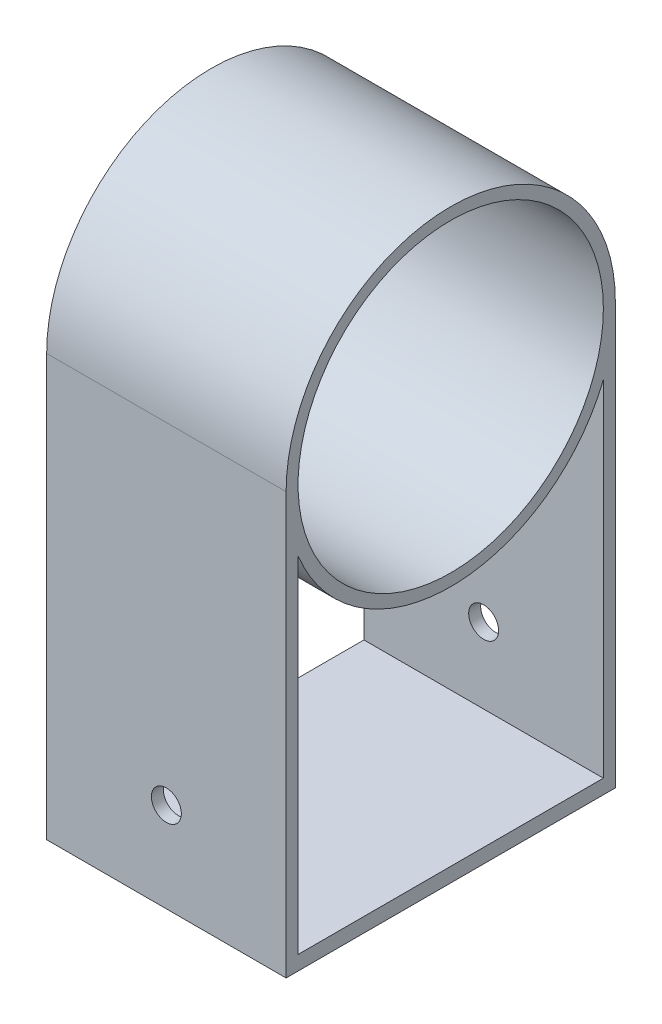
ISO-10303-21;
HEADER;
FILE_DESCRIPTION(('STEP AP214'),'2;1');
FILE_NAME('part.step','',(''),(''),'','','');
FILE_SCHEMA(('AUTOMOTIVE_DESIGN { 1 0 10303 214 1 1 1 1 }'));
ENDSEC;
DATA;
#1=APPLICATION_CONTEXT('core data for automotive mechanical design processes');
#2=APPLICATION_PROTOCOL_DEFINITION('international standard','automotive_design',2000,#1);
#3=PRODUCT_CONTEXT('',#1,'mechanical');
#4=PRODUCT('Part','Part','',(#3));
#5=PRODUCT_RELATED_PRODUCT_CATEGORY('part','',(#4));
#6=PRODUCT_DEFINITION_FORMATION('','',#4);
#7=PRODUCT_DEFINITION_CONTEXT('part definition',#1,'design');
#8=PRODUCT_DEFINITION('design','',#6,#7);
#9=PRODUCT_DEFINITION_SHAPE('','',#8);
#10=(LENGTH_UNIT() NAMED_UNIT(*) SI_UNIT(.MILLI.,.METRE.));
#11=(NAMED_UNIT(*) PLANE_ANGLE_UNIT() SI_UNIT($,.RADIAN.));
#12=(NAMED_UNIT(*) SI_UNIT($,.STERADIAN.) SOLID_ANGLE_UNIT());
#13=UNCERTAINTY_MEASURE_WITH_UNIT(LENGTH_MEASURE(1.E-05),#10,'distance_accuracy_value','');
#14=(GEOMETRIC_REPRESENTATION_CONTEXT(3) GLOBAL_UNCERTAINTY_ASSIGNED_CONTEXT((#13)) GLOBAL_UNIT_ASSIGNED_CONTEXT((#10,
#11,#12)) REPRESENTATION_CONTEXT('',''));
#15=CARTESIAN_POINT('',(0.,0.,0.));
#16=DIRECTION('',(0.,0.,1.));
#17=DIRECTION('',(1.,0.,0.));
#18=AXIS2_PLACEMENT_3D('',#15,#16,#17);
#19=CARTESIAN_POINT('',(-40.,0.,0.));
#20=DIRECTION('',(1.,0.,0.));
#21=DIRECTION('',(0.,0.,-1.));
#22=AXIS2_PLACEMENT_3D('',#19,#20,#21);
#23=CYLINDRICAL_SURFACE('',#22,27.5);
#24=CARTESIAN_POINT('',(0.,0.,0.));
#25=DIRECTION('',(1.,0.,0.));
#26=DIRECTION('',(0.,0.,-1.));
#27=AXIS2_PLACEMENT_3D('',#24,#25,#26);
#28=CIRCLE('',#27,27.5);
#29=CARTESIAN_POINT('',(0.,0.,-27.5));
#30=VERTEX_POINT('',#29);
#31=CARTESIAN_POINT('',(0.,0.,27.5));
#32=VERTEX_POINT('',#31);
#33=EDGE_CURVE('E161',#30,#32,#28,.T.);
#34=ORIENTED_EDGE('',*,*,#33,.F.);
#35=DIRECTION('',(1.,0.,0.));
#36=VECTOR('',#35,1.);
#37=CARTESIAN_POINT('',(-40.,0.,-27.5));
#38=LINE('',#37,#36);
#39=CARTESIAN_POINT('',(-40.,0.,-27.5));
#40=VERTEX_POINT('',#39);
#41=EDGE_CURVE('E11',#40,#30,#38,.T.);
#42=ORIENTED_EDGE('',*,*,#41,.F.);
#43=CARTESIAN_POINT('',(-40.,0.,0.));
#44=DIRECTION('',(1.,0.,0.));
#45=DIRECTION('',(0.,0.,-1.));
#46=AXIS2_PLACEMENT_3D('',#43,#44,#45);
#47=CIRCLE('',#46,27.5);
#48=CARTESIAN_POINT('',(-40.,0.,27.5));
#49=VERTEX_POINT('',#48);
#50=EDGE_CURVE('E165',#40,#49,#47,.T.);
#51=ORIENTED_EDGE('',*,*,#50,.T.);
#52=DIRECTION('',(1.,0.,0.));
#53=VECTOR('',#52,1.);
#54=CARTESIAN_POINT('',(-40.,0.,27.5));
#55=LINE('',#54,#53);
#56=EDGE_CURVE('E182',#49,#32,#55,.T.);
#57=ORIENTED_EDGE('',*,*,#56,.T.);
#58=EDGE_LOOP('',(#34,#42,#51,#57));
#59=FACE_BOUND('',#58,.T.);
#60=ADVANCED_FACE('F39',(#59),#23,.T.);
#61=CARTESIAN_POINT('',(-40.,-70.3541191911258,-27.5));
#62=DIRECTION('',(0.,0.,-1.));
#63=DIRECTION('',(-1.,0.,0.));
#64=AXIS2_PLACEMENT_3D('',#61,#62,#63);
#65=PLANE('',#64);
#66=CARTESIAN_POINT('',(-20.,-55.3541191911258,-27.5));
#67=DIRECTION('',(0.,0.,1.));
#68=DIRECTION('',(1.,0.,0.));
#69=AXIS2_PLACEMENT_3D('',#66,#67,#68);
#70=CIRCLE('',#69,2.5);
#71=CARTESIAN_POINT('',(-17.5,-55.3541191911258,-27.5));
#72=VERTEX_POINT('',#71);
#73=EDGE_CURVE('E340',#72,#72,#70,.T.);
#74=ORIENTED_EDGE('',*,*,#73,.T.);
#75=EDGE_LOOP('',(#74));
#76=FACE_BOUND('',#75,.T.);
#77=DIRECTION('',(0.,1.,0.));
#78=VECTOR('',#77,1.);
#79=CARTESIAN_POINT('',(0.,-70.3541191911258,-27.5));
#80=LINE('',#79,#78);
#81=CARTESIAN_POINT('',(0.,-70.3541191911258,-27.5));
#82=VERTEX_POINT('',#81);
#83=EDGE_CURVE('E170',#82,#30,#80,.T.);
#84=ORIENTED_EDGE('',*,*,#83,.F.);
#85=DIRECTION('',(1.,0.,0.));
#86=VECTOR('',#85,1.);
#87=CARTESIAN_POINT('',(-40.,-70.3541191911258,-27.5));
#88=LINE('',#87,#86);
#89=CARTESIAN_POINT('',(-40.,-70.3541191911258,-27.5));
#90=VERTEX_POINT('',#89);
#91=EDGE_CURVE('E48',#90,#82,#88,.T.);
#92=ORIENTED_EDGE('',*,*,#91,.F.);
#93=DIRECTION('',(0.,1.,0.));
#94=VECTOR('',#93,1.);
#95=CARTESIAN_POINT('',(-40.,-70.3541191911258,-27.5));
#96=LINE('',#95,#94);
#97=EDGE_CURVE('E178',#90,#40,#96,.T.);
#98=ORIENTED_EDGE('',*,*,#97,.T.);
#99=ORIENTED_EDGE('',*,*,#41,.T.);
#100=EDGE_LOOP('',(#84,#92,#98,#99));
#101=FACE_BOUND('',#100,.T.);
#102=ADVANCED_FACE('F214',(#76,#101),#65,.T.);
#103=CARTESIAN_POINT('',(-40.,-70.3541191911258,27.5));
#104=DIRECTION('',(0.,-1.,0.));
#105=DIRECTION('',(0.,0.,-1.));
#106=AXIS2_PLACEMENT_3D('',#103,#104,#105);
#107=PLANE('',#106);
#108=DIRECTION('',(0.,0.,-1.));
#109=VECTOR('',#108,1.);
#110=CARTESIAN_POINT('',(0.,-70.3541191911258,27.5));
#111=LINE('',#110,#109);
#112=CARTESIAN_POINT('',(0.,-70.3541191911258,27.5));
#113=VERTEX_POINT('',#112);
#114=EDGE_CURVE('E190',#113,#82,#111,.T.);
#115=ORIENTED_EDGE('',*,*,#114,.F.);
#116=DIRECTION('',(1.,0.,0.));
#117=VECTOR('',#116,1.);
#118=CARTESIAN_POINT('',(-40.,-70.3541191911258,27.5));
#119=LINE('',#118,#117);
#120=CARTESIAN_POINT('',(-40.,-70.3541191911258,27.5));
#121=VERTEX_POINT('',#120);
#122=EDGE_CURVE('E199',#121,#113,#119,.T.);
#123=ORIENTED_EDGE('',*,*,#122,.F.);
#124=DIRECTION('',(0.,0.,-1.));
#125=VECTOR('',#124,1.);
#126=CARTESIAN_POINT('',(-40.,-70.3541191911258,27.5));
#127=LINE('',#126,#125);
#128=EDGE_CURVE('E174',#121,#90,#127,.T.);
#129=ORIENTED_EDGE('',*,*,#128,.T.);
#130=ORIENTED_EDGE('',*,*,#91,.T.);
#131=EDGE_LOOP('',(#115,#123,#129,#130));
#132=FACE_BOUND('',#131,.T.);
#133=ADVANCED_FACE('F219',(#132),#107,.T.);
#134=CARTESIAN_POINT('',(-40.,0.,27.5));
#135=DIRECTION('',(0.,0.,1.));
#136=DIRECTION('',(1.,0.,0.));
#137=AXIS2_PLACEMENT_3D('',#134,#135,#136);
#138=PLANE('',#137);
#139=CARTESIAN_POINT('',(-20.,-55.3541191911258,27.5));
#140=DIRECTION('',(0.,0.,1.));
#141=DIRECTION('',(1.,0.,0.));
#142=AXIS2_PLACEMENT_3D('',#139,#140,#141);
#143=CIRCLE('',#142,2.5);
#144=CARTESIAN_POINT('',(-17.5,-55.3541191911258,27.5));
#145=VERTEX_POINT('',#144);
#146=EDGE_CURVE('E348',#145,#145,#143,.T.);
#147=ORIENTED_EDGE('',*,*,#146,.F.);
#148=EDGE_LOOP('',(#147));
#149=FACE_BOUND('',#148,.T.);
#150=DIRECTION('',(0.,-1.,0.));
#151=VECTOR('',#150,1.);
#152=CARTESIAN_POINT('',(0.,0.,27.5));
#153=LINE('',#152,#151);
#154=EDGE_CURVE('E186',#32,#113,#153,.T.);
#155=ORIENTED_EDGE('',*,*,#154,.F.);
#156=ORIENTED_EDGE('',*,*,#56,.F.);
#157=DIRECTION('',(0.,-1.,0.));
#158=VECTOR('',#157,1.);
#159=CARTESIAN_POINT('',(-40.,0.,27.5));
#160=LINE('',#159,#158);
#161=EDGE_CURVE('E169',#49,#121,#160,.T.);
#162=ORIENTED_EDGE('',*,*,#161,.T.);
#163=ORIENTED_EDGE('',*,*,#122,.T.);
#164=EDGE_LOOP('',(#155,#156,#162,#163));
#165=FACE_BOUND('',#164,.T.);
#166=ADVANCED_FACE('F208',(#149,#165),#138,.T.);
#167=CARTESIAN_POINT('',(-40.,0.,0.));
#168=DIRECTION('',(1.,0.,0.));
#169=DIRECTION('',(0.,0.,-1.));
#170=AXIS2_PLACEMENT_3D('',#167,#168,#169);
#171=PLANE('',#170);
#172=DIRECTION('',(0.,1.,0.));
#173=VECTOR('',#172,1.);
#174=CARTESIAN_POINT('',(-40.,-67.9456465055895,-25.5));
#175=LINE('',#174,#173);
#176=CARTESIAN_POINT('',(-40.,-67.9456465055895,-25.5));
#177=VERTEX_POINT('',#176);
#178=CARTESIAN_POINT('',(-40.,-10.295630140987,-25.5));
#179=VERTEX_POINT('',#178);
#180=EDGE_CURVE('E114',#177,#179,#175,.T.);
#181=ORIENTED_EDGE('',*,*,#180,.T.);
#182=CARTESIAN_POINT('',(-40.,0.,0.));
#183=DIRECTION('',(-1.,0.,0.));
#184=DIRECTION('',(0.,0.,-1.));
#185=AXIS2_PLACEMENT_3D('',#182,#183,#184);
#186=CIRCLE('',#185,27.5);
#187=CARTESIAN_POINT('',(-40.,-10.295630140987,25.5));
#188=VERTEX_POINT('',#187);
#189=EDGE_CURVE('E107',#179,#188,#186,.T.);
#190=ORIENTED_EDGE('',*,*,#189,.T.);
#191=DIRECTION('',(0.,-1.,0.));
#192=VECTOR('',#191,1.);
#193=CARTESIAN_POINT('',(-40.,-10.295630140987,25.5));
#194=LINE('',#193,#192);
#195=CARTESIAN_POINT('',(-40.,-67.9456465055895,25.5));
#196=VERTEX_POINT('',#195);
#197=EDGE_CURVE('E117',#188,#196,#194,.T.);
#198=ORIENTED_EDGE('',*,*,#197,.T.);
#199=DIRECTION('',(0.,0.,-1.));
#200=VECTOR('',#199,1.);
#201=CARTESIAN_POINT('',(-40.,-67.9456465055895,25.5));
#202=LINE('',#201,#200);
#203=EDGE_CURVE('E56',#196,#177,#202,.T.);
#204=ORIENTED_EDGE('',*,*,#203,.T.);
#205=EDGE_LOOP('',(#181,#190,#198,#204));
#206=FACE_BOUND('',#205,.T.);
#207=CARTESIAN_POINT('',(-40.,0.,0.));
#208=DIRECTION('',(1.,0.,0.));
#209=DIRECTION('',(0.,0.,-1.));
#210=AXIS2_PLACEMENT_3D('',#207,#208,#209);
#211=CIRCLE('',#210,25.5);
#212=CARTESIAN_POINT('',(-40.,0.,-25.5));
#213=VERTEX_POINT('',#212);
#214=EDGE_CURVE('E157',#213,#213,#211,.T.);
#215=ORIENTED_EDGE('',*,*,#214,.T.);
#216=EDGE_LOOP('',(#215));
#217=FACE_BOUND('',#216,.T.);
#218=ORIENTED_EDGE('',*,*,#50,.F.);
#219=ORIENTED_EDGE('',*,*,#97,.F.);
#220=ORIENTED_EDGE('',*,*,#128,.F.);
#221=ORIENTED_EDGE('',*,*,#161,.F.);
#222=EDGE_LOOP('',(#218,#219,#220,#221));
#223=FACE_BOUND('',#222,.T.);
#224=ADVANCED_FACE('F122',(#206,#217,#223),#171,.F.);
#225=CARTESIAN_POINT('',(0.,0.,0.));
#226=DIRECTION('',(1.,0.,0.));
#227=DIRECTION('',(0.,0.,-1.));
#228=AXIS2_PLACEMENT_3D('',#225,#226,#227);
#229=PLANE('',#228);
#230=CARTESIAN_POINT('',(0.,0.,0.));
#231=DIRECTION('',(-1.,0.,0.));
#232=DIRECTION('',(0.,0.,-1.));
#233=AXIS2_PLACEMENT_3D('',#230,#231,#232);
#234=CIRCLE('',#233,27.5);
#235=CARTESIAN_POINT('',(0.,-10.295630140987,-25.5));
#236=VERTEX_POINT('',#235);
#237=CARTESIAN_POINT('',(0.,-10.295630140987,25.5));
#238=VERTEX_POINT('',#237);
#239=EDGE_CURVE('E64',#236,#238,#234,.T.);
#240=ORIENTED_EDGE('',*,*,#239,.F.);
#241=DIRECTION('',(0.,1.,0.));
#242=VECTOR('',#241,1.);
#243=CARTESIAN_POINT('',(0.,-67.9456465055895,-25.5));
#244=LINE('',#243,#242);
#245=CARTESIAN_POINT('',(0.,-67.9456465055895,-25.5));
#246=VERTEX_POINT('',#245);
#247=EDGE_CURVE('E126',#246,#236,#244,.T.);
#248=ORIENTED_EDGE('',*,*,#247,.F.);
#249=DIRECTION('',(0.,0.,-1.));
#250=VECTOR('',#249,1.);
#251=CARTESIAN_POINT('',(0.,-67.9456465055895,25.5));
#252=LINE('',#251,#250);
#253=CARTESIAN_POINT('',(0.,-67.9456465055895,25.5));
#254=VERTEX_POINT('',#253);
#255=EDGE_CURVE('E130',#254,#246,#252,.T.);
#256=ORIENTED_EDGE('',*,*,#255,.F.);
#257=DIRECTION('',(0.,-1.,0.));
#258=VECTOR('',#257,1.);
#259=CARTESIAN_POINT('',(0.,-10.295630140987,25.5));
#260=LINE('',#259,#258);
#261=EDGE_CURVE('E142',#238,#254,#260,.T.);
#262=ORIENTED_EDGE('',*,*,#261,.F.);
#263=EDGE_LOOP('',(#240,#248,#256,#262));
#264=FACE_BOUND('',#263,.T.);
#265=CARTESIAN_POINT('',(0.,0.,0.));
#266=DIRECTION('',(1.,0.,0.));
#267=DIRECTION('',(0.,0.,-1.));
#268=AXIS2_PLACEMENT_3D('',#265,#266,#267);
#269=CIRCLE('',#268,25.5);
#270=CARTESIAN_POINT('',(0.,0.,-25.5));
#271=VERTEX_POINT('',#270);
#272=EDGE_CURVE('E151',#271,#271,#269,.T.);
#273=ORIENTED_EDGE('',*,*,#272,.F.);
#274=EDGE_LOOP('',(#273));
#275=FACE_BOUND('',#274,.T.);
#276=ORIENTED_EDGE('',*,*,#33,.T.);
#277=ORIENTED_EDGE('',*,*,#154,.T.);
#278=ORIENTED_EDGE('',*,*,#114,.T.);
#279=ORIENTED_EDGE('',*,*,#83,.T.);
#280=EDGE_LOOP('',(#276,#277,#278,#279));
#281=FACE_BOUND('',#280,.T.);
#282=ADVANCED_FACE('F211',(#264,#275,#281),#229,.T.);
#283=CARTESIAN_POINT('',(-40.,0.,0.));
#284=DIRECTION('',(1.,0.,0.));
#285=DIRECTION('',(0.,0.,-1.));
#286=AXIS2_PLACEMENT_3D('',#283,#284,#285);
#287=CYLINDRICAL_SURFACE('',#286,25.5);
#288=ORIENTED_EDGE('',*,*,#214,.F.);
#289=EDGE_LOOP('',(#288));
#290=FACE_BOUND('',#289,.T.);
#291=ORIENTED_EDGE('',*,*,#272,.T.);
#292=EDGE_LOOP('',(#291));
#293=FACE_BOUND('',#292,.T.);
#294=ADVANCED_FACE('F300',(#290,#293),#287,.F.);
#295=CARTESIAN_POINT('',(-40.,0.,0.));
#296=DIRECTION('',(1.,0.,0.));
#297=DIRECTION('',(0.,0.,-1.));
#298=AXIS2_PLACEMENT_3D('',#295,#296,#297);
#299=CYLINDRICAL_SURFACE('',#298,27.5);
#300=ORIENTED_EDGE('',*,*,#239,.T.);
#301=DIRECTION('',(1.,0.,0.));
#302=VECTOR('',#301,1.);
#303=CARTESIAN_POINT('',(-40.,-10.295630140987,25.5));
#304=LINE('',#303,#302);
#305=EDGE_CURVE('E103',#188,#238,#304,.T.);
#306=ORIENTED_EDGE('',*,*,#305,.F.);
#307=ORIENTED_EDGE('',*,*,#189,.F.);
#308=DIRECTION('',(1.,0.,0.));
#309=VECTOR('',#308,1.);
#310=CARTESIAN_POINT('',(-40.,-10.295630140987,-25.5));
#311=LINE('',#310,#309);
#312=EDGE_CURVE('E148',#179,#236,#311,.T.);
#313=ORIENTED_EDGE('',*,*,#312,.T.);
#314=EDGE_LOOP('',(#300,#306,#307,#313));
#315=FACE_BOUND('',#314,.T.);
#316=ADVANCED_FACE('F105',(#315),#299,.T.);
#317=CARTESIAN_POINT('',(-40.,-67.9456465055895,-25.5));
#318=DIRECTION('',(0.,0.,-1.));
#319=DIRECTION('',(-1.,0.,0.));
#320=AXIS2_PLACEMENT_3D('',#317,#318,#319);
#321=PLANE('',#320);
#322=CARTESIAN_POINT('',(-20.,-55.3541191911258,-25.5));
#323=DIRECTION('',(0.,0.,-1.));
#324=DIRECTION('',(-1.,0.,0.));
#325=AXIS2_PLACEMENT_3D('',#322,#323,#324);
#326=CIRCLE('',#325,2.5);
#327=CARTESIAN_POINT('',(-22.5,-55.3541191911258,-25.5));
#328=VERTEX_POINT('',#327);
#329=EDGE_CURVE('E133',#328,#328,#326,.T.);
#330=ORIENTED_EDGE('',*,*,#329,.T.);
#331=EDGE_LOOP('',(#330));
#332=FACE_BOUND('',#331,.T.);
#333=ORIENTED_EDGE('',*,*,#247,.T.);
#334=ORIENTED_EDGE('',*,*,#312,.F.);
#335=ORIENTED_EDGE('',*,*,#180,.F.);
#336=DIRECTION('',(1.,0.,0.));
#337=VECTOR('',#336,1.);
#338=CARTESIAN_POINT('',(-40.,-67.9456465055895,-25.5));
#339=LINE('',#338,#337);
#340=EDGE_CURVE('E152',#177,#246,#339,.T.);
#341=ORIENTED_EDGE('',*,*,#340,.T.);
#342=EDGE_LOOP('',(#333,#334,#335,#341));
#343=FACE_BOUND('',#342,.T.);
#344=ADVANCED_FACE('F256',(#332,#343),#321,.F.);
#345=CARTESIAN_POINT('',(-40.,-67.9456465055895,25.5));
#346=DIRECTION('',(0.,-1.,0.));
#347=DIRECTION('',(0.,0.,-1.));
#348=AXIS2_PLACEMENT_3D('',#345,#346,#347);
#349=PLANE('',#348);
#350=ORIENTED_EDGE('',*,*,#255,.T.);
#351=ORIENTED_EDGE('',*,*,#340,.F.);
#352=ORIENTED_EDGE('',*,*,#203,.F.);
#353=DIRECTION('',(1.,0.,0.));
#354=VECTOR('',#353,1.);
#355=CARTESIAN_POINT('',(-40.,-67.9456465055895,25.5));
#356=LINE('',#355,#354);
#357=EDGE_CURVE('E113',#196,#254,#356,.T.);
#358=ORIENTED_EDGE('',*,*,#357,.T.);
#359=EDGE_LOOP('',(#350,#351,#352,#358));
#360=FACE_BOUND('',#359,.T.);
#361=ADVANCED_FACE('F243',(#360),#349,.F.);
#362=CARTESIAN_POINT('',(-40.,-10.295630140987,25.5));
#363=DIRECTION('',(0.,0.,1.));
#364=DIRECTION('',(1.,0.,0.));
#365=AXIS2_PLACEMENT_3D('',#362,#363,#364);
#366=PLANE('',#365);
#367=CARTESIAN_POINT('',(-20.,-55.3541191911258,25.5));
#368=DIRECTION('',(0.,0.,1.));
#369=DIRECTION('',(1.,0.,0.));
#370=AXIS2_PLACEMENT_3D('',#367,#368,#369);
#371=CIRCLE('',#370,2.5);
#372=CARTESIAN_POINT('',(-17.5,-55.3541191911258,25.5));
#373=VERTEX_POINT('',#372);
#374=EDGE_CURVE('E42',#373,#373,#371,.T.);
#375=ORIENTED_EDGE('',*,*,#374,.T.);
#376=EDGE_LOOP('',(#375));
#377=FACE_BOUND('',#376,.T.);
#378=ORIENTED_EDGE('',*,*,#261,.T.);
#379=ORIENTED_EDGE('',*,*,#357,.F.);
#380=ORIENTED_EDGE('',*,*,#197,.F.);
#381=ORIENTED_EDGE('',*,*,#305,.T.);
#382=EDGE_LOOP('',(#378,#379,#380,#381));
#383=FACE_BOUND('',#382,.T.);
#384=ADVANCED_FACE('F118',(#377,#383),#366,.F.);
#385=CARTESIAN_POINT('',(-20.,-55.3541191911258,-27.5));
#386=DIRECTION('',(0.,0.,1.));
#387=DIRECTION('',(1.,0.,0.));
#388=AXIS2_PLACEMENT_3D('',#385,#386,#387);
#389=CYLINDRICAL_SURFACE('',#388,2.5);
#390=ORIENTED_EDGE('',*,*,#146,.T.);
#391=EDGE_LOOP('',(#390));
#392=FACE_BOUND('',#391,.T.);
#393=ORIENTED_EDGE('',*,*,#374,.F.);
#394=EDGE_LOOP('',(#393));
#395=FACE_BOUND('',#394,.T.);
#396=ADVANCED_FACE('F272',(#392,#395),#389,.F.);
#397=ORIENTED_EDGE('',*,*,#73,.F.);
#398=EDGE_LOOP('',(#397));
#399=FACE_BOUND('',#398,.T.);
#400=ORIENTED_EDGE('',*,*,#329,.F.);
#401=EDGE_LOOP('',(#400));
#402=FACE_BOUND('',#401,.T.);
#403=ADVANCED_FACE('F282',(#399,#402),#389,.F.);
#404=CLOSED_SHELL('',(#60,#102,#133,#166,#224,#282,#294,#316,#344,#361,#384,#396,#403));
#405=MANIFOLD_SOLID_BREP('B2',#404);
#406=ADVANCED_BREP_SHAPE_REPRESENTATION('',(#18,#405),#14);
#407=SHAPE_DEFINITION_REPRESENTATION(#9,#406);
ENDSEC;
END-ISO-10303-21;
